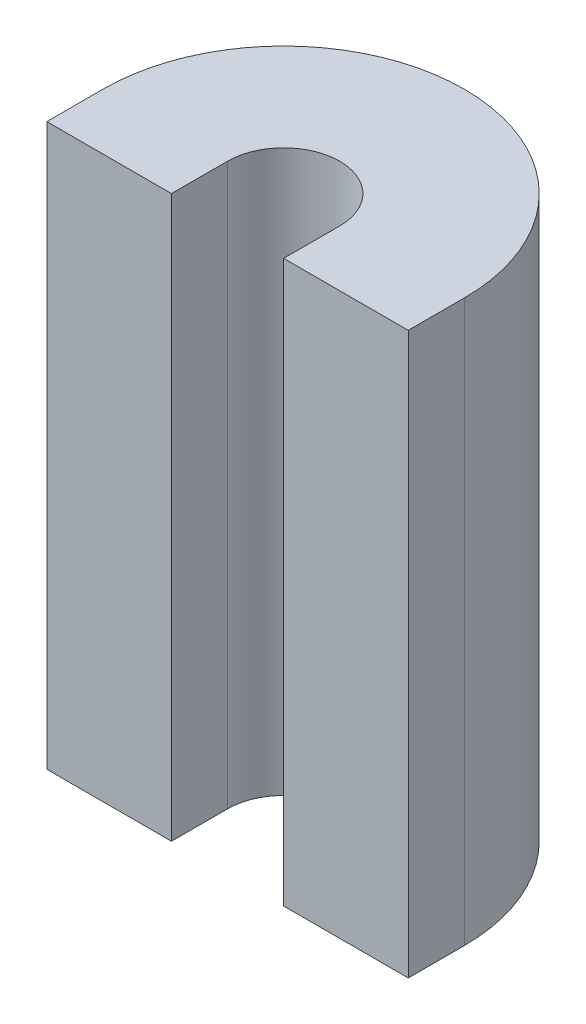
ISO-10303-21;
HEADER;
FILE_DESCRIPTION(('STEP AP214'),'2;1');
FILE_NAME('part.step','',(''),(''),'','','');
FILE_SCHEMA(('AUTOMOTIVE_DESIGN { 1 0 10303 214 1 1 1 1 }'));
ENDSEC;
DATA;
#1=APPLICATION_CONTEXT('core data for automotive mechanical design processes');
#2=APPLICATION_PROTOCOL_DEFINITION('international standard','automotive_design',2000,#1);
#3=PRODUCT_CONTEXT('',#1,'mechanical');
#4=PRODUCT('Part','Part','',(#3));
#5=PRODUCT_RELATED_PRODUCT_CATEGORY('part','',(#4));
#6=PRODUCT_DEFINITION_FORMATION('','',#4);
#7=PRODUCT_DEFINITION_CONTEXT('part definition',#1,'design');
#8=PRODUCT_DEFINITION('design','',#6,#7);
#9=PRODUCT_DEFINITION_SHAPE('','',#8);
#10=(LENGTH_UNIT() NAMED_UNIT(*) SI_UNIT(.MILLI.,.METRE.));
#11=(NAMED_UNIT(*) PLANE_ANGLE_UNIT() SI_UNIT($,.RADIAN.));
#12=(NAMED_UNIT(*) SI_UNIT($,.STERADIAN.) SOLID_ANGLE_UNIT());
#13=UNCERTAINTY_MEASURE_WITH_UNIT(LENGTH_MEASURE(1.E-05),#10,'distance_accuracy_value','');
#14=(GEOMETRIC_REPRESENTATION_CONTEXT(3) GLOBAL_UNCERTAINTY_ASSIGNED_CONTEXT((#13)) GLOBAL_UNIT_ASSIGNED_CONTEXT((#10,
#11,#12)) REPRESENTATION_CONTEXT('',''));
#15=CARTESIAN_POINT('',(0.,0.,0.));
#16=DIRECTION('',(0.,0.,1.));
#17=DIRECTION('',(1.,0.,0.));
#18=AXIS2_PLACEMENT_3D('',#15,#16,#17);
#19=CARTESIAN_POINT('',(-1.8,18.,-1.8));
#20=DIRECTION('',(-1.,0.,-8.08694353766133E-13));
#21=DIRECTION('',(-8.08694353766133E-13,0.,1.));
#22=AXIS2_PLACEMENT_3D('',#19,#20,#21);
#23=PLANE('',#22);
#24=DIRECTION('',(8.08694353766132E-13,0.,-1.));
#25=VECTOR('',#24,1.);
#26=CARTESIAN_POINT('',(-1.8,0.,-1.8));
#27=LINE('',#26,#25);
#28=CARTESIAN_POINT('',(-1.80000000000146,0.,0.));
#29=VERTEX_POINT('',#28);
#30=CARTESIAN_POINT('',(-1.8,0.,-1.8));
#31=VERTEX_POINT('',#30);
#32=EDGE_CURVE('E128',#29,#31,#27,.T.);
#33=ORIENTED_EDGE('',*,*,#32,.T.);
#34=DIRECTION('',(0.,-1.,0.));
#35=VECTOR('',#34,1.);
#36=CARTESIAN_POINT('',(-1.8,18.,-1.8));
#37=LINE('',#36,#35);
#38=CARTESIAN_POINT('',(-1.8,18.,-1.8));
#39=VERTEX_POINT('',#38);
#40=EDGE_CURVE('E11',#39,#31,#37,.T.);
#41=ORIENTED_EDGE('',*,*,#40,.F.);
#42=DIRECTION('',(8.08694353766132E-13,0.,-1.));
#43=VECTOR('',#42,1.);
#44=CARTESIAN_POINT('',(-1.8,18.,-1.8));
#45=LINE('',#44,#43);
#46=CARTESIAN_POINT('',(-1.80000000000146,18.,0.));
#47=VERTEX_POINT('',#46);
#48=EDGE_CURVE('E143',#47,#39,#45,.T.);
#49=ORIENTED_EDGE('',*,*,#48,.F.);
#50=DIRECTION('',(0.,-1.,0.));
#51=VECTOR('',#50,1.);
#52=CARTESIAN_POINT('',(-1.80000000000146,18.,0.));
#53=LINE('',#52,#51);
#54=EDGE_CURVE('E124',#47,#29,#53,.T.);
#55=ORIENTED_EDGE('',*,*,#54,.T.);
#56=EDGE_LOOP('',(#33,#41,#49,#55));
#57=FACE_BOUND('',#56,.T.);
#58=ADVANCED_FACE('F33',(#57),#23,.F.);
#59=CARTESIAN_POINT('',(0.,18.,-1.79999999999999));
#60=DIRECTION('',(0.,-1.,0.));
#61=DIRECTION('',(0.,0.,-1.));
#62=AXIS2_PLACEMENT_3D('',#59,#60,#61);
#63=CYLINDRICAL_SURFACE('',#62,1.8);
#64=CARTESIAN_POINT('',(0.,0.,-1.79999999999999));
#65=DIRECTION('',(0.,-1.,0.));
#66=DIRECTION('',(0.,0.,1.));
#67=AXIS2_PLACEMENT_3D('',#64,#65,#66);
#68=CIRCLE('',#67,1.8);
#69=CARTESIAN_POINT('',(1.8,0.,-1.8));
#70=VERTEX_POINT('',#69);
#71=EDGE_CURVE('E131',#31,#70,#68,.T.);
#72=ORIENTED_EDGE('',*,*,#71,.T.);
#73=DIRECTION('',(0.,-1.,0.));
#74=VECTOR('',#73,1.);
#75=CARTESIAN_POINT('',(1.8,18.,-1.8));
#76=LINE('',#75,#74);
#77=CARTESIAN_POINT('',(1.8,18.,-1.8));
#78=VERTEX_POINT('',#77);
#79=EDGE_CURVE('E41',#78,#70,#76,.T.);
#80=ORIENTED_EDGE('',*,*,#79,.F.);
#81=CARTESIAN_POINT('',(0.,18.,-1.79999999999999));
#82=DIRECTION('',(0.,-1.,0.));
#83=DIRECTION('',(0.,0.,-1.));
#84=AXIS2_PLACEMENT_3D('',#81,#82,#83);
#85=CIRCLE('',#84,1.80000000000001);
#86=EDGE_CURVE('E92',#39,#78,#85,.T.);
#87=ORIENTED_EDGE('',*,*,#86,.F.);
#88=ORIENTED_EDGE('',*,*,#40,.T.);
#89=EDGE_LOOP('',(#72,#80,#87,#88));
#90=FACE_BOUND('',#89,.T.);
#91=ADVANCED_FACE('F178',(#90),#63,.F.);
#92=CARTESIAN_POINT('',(1.8,18.,-1.8));
#93=DIRECTION('',(1.,0.,-8.15681434433262E-13));
#94=DIRECTION('',(-8.15681434433262E-13,0.,-1.));
#95=AXIS2_PLACEMENT_3D('',#92,#93,#94);
#96=PLANE('',#95);
#97=DIRECTION('',(8.15681434433261E-13,0.,1.));
#98=VECTOR('',#97,1.);
#99=CARTESIAN_POINT('',(1.8,0.,-1.8));
#100=LINE('',#99,#98);
#101=CARTESIAN_POINT('',(1.80000000000147,0.,0.));
#102=VERTEX_POINT('',#101);
#103=EDGE_CURVE('E133',#70,#102,#100,.T.);
#104=ORIENTED_EDGE('',*,*,#103,.T.);
#105=DIRECTION('',(0.,-1.,0.));
#106=VECTOR('',#105,1.);
#107=CARTESIAN_POINT('',(1.80000000000147,18.,0.));
#108=LINE('',#107,#106);
#109=CARTESIAN_POINT('',(1.80000000000147,18.,0.));
#110=VERTEX_POINT('',#109);
#111=EDGE_CURVE('E150',#110,#102,#108,.T.);
#112=ORIENTED_EDGE('',*,*,#111,.F.);
#113=DIRECTION('',(8.15681434433261E-13,0.,1.));
#114=VECTOR('',#113,1.);
#115=CARTESIAN_POINT('',(1.8,18.,-1.8));
#116=LINE('',#115,#114);
#117=EDGE_CURVE('E158',#78,#110,#116,.T.);
#118=ORIENTED_EDGE('',*,*,#117,.F.);
#119=ORIENTED_EDGE('',*,*,#79,.T.);
#120=EDGE_LOOP('',(#104,#112,#118,#119));
#121=FACE_BOUND('',#120,.T.);
#122=ADVANCED_FACE('F156',(#121),#96,.F.);
#123=CARTESIAN_POINT('',(1.80000000000147,18.,0.));
#124=DIRECTION('',(0.,0.,-1.));
#125=DIRECTION('',(-1.,0.,0.));
#126=AXIS2_PLACEMENT_3D('',#123,#124,#125);
#127=PLANE('',#126);
#128=DIRECTION('',(1.,0.,0.));
#129=VECTOR('',#128,1.);
#130=CARTESIAN_POINT('',(1.80000000000147,0.,0.));
#131=LINE('',#130,#129);
#132=CARTESIAN_POINT('',(5.80000000000001,0.,0.));
#133=VERTEX_POINT('',#132);
#134=EDGE_CURVE('E135',#102,#133,#131,.T.);
#135=ORIENTED_EDGE('',*,*,#134,.T.);
#136=DIRECTION('',(0.,-1.,0.));
#137=VECTOR('',#136,1.);
#138=CARTESIAN_POINT('',(5.80000000000001,18.,0.));
#139=LINE('',#138,#137);
#140=CARTESIAN_POINT('',(5.80000000000001,18.,0.));
#141=VERTEX_POINT('',#140);
#142=EDGE_CURVE('E147',#141,#133,#139,.T.);
#143=ORIENTED_EDGE('',*,*,#142,.F.);
#144=DIRECTION('',(1.,0.,0.));
#145=VECTOR('',#144,1.);
#146=CARTESIAN_POINT('',(1.80000000000147,18.,0.));
#147=LINE('',#146,#145);
#148=EDGE_CURVE('E170',#110,#141,#147,.T.);
#149=ORIENTED_EDGE('',*,*,#148,.F.);
#150=ORIENTED_EDGE('',*,*,#111,.T.);
#151=EDGE_LOOP('',(#135,#143,#149,#150));
#152=FACE_BOUND('',#151,.T.);
#153=ADVANCED_FACE('F166',(#152),#127,.F.);
#154=CARTESIAN_POINT('',(5.80000000000001,18.,0.));
#155=DIRECTION('',(-1.,0.,0.));
#156=DIRECTION('',(0.,0.,1.));
#157=AXIS2_PLACEMENT_3D('',#154,#155,#156);
#158=PLANE('',#157);
#159=DIRECTION('',(0.,0.,-1.));
#160=VECTOR('',#159,1.);
#161=CARTESIAN_POINT('',(5.80000000000001,0.,0.));
#162=LINE('',#161,#160);
#163=CARTESIAN_POINT('',(5.80000000000001,0.,-1.80000000000002));
#164=VERTEX_POINT('',#163);
#165=EDGE_CURVE('E137',#133,#164,#162,.T.);
#166=ORIENTED_EDGE('',*,*,#165,.T.);
#167=DIRECTION('',(0.,-1.,0.));
#168=VECTOR('',#167,1.);
#169=CARTESIAN_POINT('',(5.80000000000001,18.,-1.80000000000002));
#170=LINE('',#169,#168);
#171=CARTESIAN_POINT('',(5.80000000000001,18.,-1.80000000000002));
#172=VERTEX_POINT('',#171);
#173=EDGE_CURVE('E119',#172,#164,#170,.T.);
#174=ORIENTED_EDGE('',*,*,#173,.F.);
#175=DIRECTION('',(0.,0.,-1.));
#176=VECTOR('',#175,1.);
#177=CARTESIAN_POINT('',(5.80000000000001,18.,0.));
#178=LINE('',#177,#176);
#179=EDGE_CURVE('E111',#141,#172,#178,.T.);
#180=ORIENTED_EDGE('',*,*,#179,.F.);
#181=ORIENTED_EDGE('',*,*,#142,.T.);
#182=EDGE_LOOP('',(#166,#174,#180,#181));
#183=FACE_BOUND('',#182,.T.);
#184=ADVANCED_FACE('F169',(#183),#158,.F.);
#185=CARTESIAN_POINT('',(0.,18.,-1.79999999999999));
#186=DIRECTION('',(0.,-1.,0.));
#187=DIRECTION('',(0.,0.,-1.));
#188=AXIS2_PLACEMENT_3D('',#185,#186,#187);
#189=CYLINDRICAL_SURFACE('',#188,5.80000000000001);
#190=CARTESIAN_POINT('',(0.,0.,-1.79999999999999));
#191=DIRECTION('',(0.,1.,0.));
#192=DIRECTION('',(0.,0.,-1.));
#193=AXIS2_PLACEMENT_3D('',#190,#191,#192);
#194=CIRCLE('',#193,5.80000000000001);
#195=CARTESIAN_POINT('',(-5.8,0.,-1.8));
#196=VERTEX_POINT('',#195);
#197=EDGE_CURVE('E118',#164,#196,#194,.T.);
#198=ORIENTED_EDGE('',*,*,#197,.T.);
#199=DIRECTION('',(0.,-1.,0.));
#200=VECTOR('',#199,1.);
#201=CARTESIAN_POINT('',(-5.8,18.,-1.8));
#202=LINE('',#201,#200);
#203=CARTESIAN_POINT('',(-5.8,18.,-1.8));
#204=VERTEX_POINT('',#203);
#205=EDGE_CURVE('E116',#204,#196,#202,.T.);
#206=ORIENTED_EDGE('',*,*,#205,.F.);
#207=CARTESIAN_POINT('',(0.,18.,-1.79999999999999));
#208=DIRECTION('',(0.,1.,0.));
#209=DIRECTION('',(0.,0.,1.));
#210=AXIS2_PLACEMENT_3D('',#207,#208,#209);
#211=CIRCLE('',#210,5.8);
#212=EDGE_CURVE('E105',#172,#204,#211,.T.);
#213=ORIENTED_EDGE('',*,*,#212,.F.);
#214=ORIENTED_EDGE('',*,*,#173,.T.);
#215=EDGE_LOOP('',(#198,#206,#213,#214));
#216=FACE_BOUND('',#215,.T.);
#217=ADVANCED_FACE('F117',(#216),#189,.T.);
#218=CARTESIAN_POINT('',(-5.8,18.,0.));
#219=DIRECTION('',(1.,0.,0.));
#220=DIRECTION('',(0.,0.,-1.));
#221=AXIS2_PLACEMENT_3D('',#218,#219,#220);
#222=PLANE('',#221);
#223=DIRECTION('',(0.,0.,1.));
#224=VECTOR('',#223,1.);
#225=CARTESIAN_POINT('',(-5.8,0.,0.));
#226=LINE('',#225,#224);
#227=CARTESIAN_POINT('',(-5.8,0.,0.));
#228=VERTEX_POINT('',#227);
#229=EDGE_CURVE('E78',#196,#228,#226,.T.);
#230=ORIENTED_EDGE('',*,*,#229,.T.);
#231=DIRECTION('',(0.,-1.,0.));
#232=VECTOR('',#231,1.);
#233=CARTESIAN_POINT('',(-5.8,18.,0.));
#234=LINE('',#233,#232);
#235=CARTESIAN_POINT('',(-5.8,18.,0.));
#236=VERTEX_POINT('',#235);
#237=EDGE_CURVE('E120',#236,#228,#234,.T.);
#238=ORIENTED_EDGE('',*,*,#237,.F.);
#239=DIRECTION('',(0.,0.,1.));
#240=VECTOR('',#239,1.);
#241=CARTESIAN_POINT('',(-5.8,18.,0.));
#242=LINE('',#241,#240);
#243=EDGE_CURVE('E109',#204,#236,#242,.T.);
#244=ORIENTED_EDGE('',*,*,#243,.F.);
#245=ORIENTED_EDGE('',*,*,#205,.T.);
#246=EDGE_LOOP('',(#230,#238,#244,#245));
#247=FACE_BOUND('',#246,.T.);
#248=ADVANCED_FACE('F122',(#247),#222,.F.);
#249=CARTESIAN_POINT('',(-1.80000000000146,18.,0.));
#250=DIRECTION('',(0.,0.,-1.));
#251=DIRECTION('',(-1.,0.,0.));
#252=AXIS2_PLACEMENT_3D('',#249,#250,#251);
#253=PLANE('',#252);
#254=DIRECTION('',(1.,0.,0.));
#255=VECTOR('',#254,1.);
#256=CARTESIAN_POINT('',(-1.80000000000146,0.,0.));
#257=LINE('',#256,#255);
#258=EDGE_CURVE('E84',#228,#29,#257,.T.);
#259=ORIENTED_EDGE('',*,*,#258,.T.);
#260=ORIENTED_EDGE('',*,*,#54,.F.);
#261=DIRECTION('',(1.,0.,0.));
#262=VECTOR('',#261,1.);
#263=CARTESIAN_POINT('',(-1.80000000000146,18.,0.));
#264=LINE('',#263,#262);
#265=EDGE_CURVE('E49',#236,#47,#264,.T.);
#266=ORIENTED_EDGE('',*,*,#265,.F.);
#267=ORIENTED_EDGE('',*,*,#237,.T.);
#268=EDGE_LOOP('',(#259,#260,#266,#267));
#269=FACE_BOUND('',#268,.T.);
#270=ADVANCED_FACE('F194',(#269),#253,.F.);
#271=CARTESIAN_POINT('',(0.,18.,-1.79999999999999));
#272=DIRECTION('',(0.,-1.,0.));
#273=DIRECTION('',(0.,0.,-1.));
#274=AXIS2_PLACEMENT_3D('',#271,#272,#273);
#275=PLANE('',#274);
#276=ORIENTED_EDGE('',*,*,#48,.T.);
#277=ORIENTED_EDGE('',*,*,#86,.T.);
#278=ORIENTED_EDGE('',*,*,#117,.T.);
#279=ORIENTED_EDGE('',*,*,#148,.T.);
#280=ORIENTED_EDGE('',*,*,#179,.T.);
#281=ORIENTED_EDGE('',*,*,#212,.T.);
#282=ORIENTED_EDGE('',*,*,#243,.T.);
#283=ORIENTED_EDGE('',*,*,#265,.T.);
#284=EDGE_LOOP('',(#276,#277,#278,#279,#280,#281,#282,#283));
#285=FACE_BOUND('',#284,.T.);
#286=ADVANCED_FACE('F107',(#285),#275,.F.);
#287=CARTESIAN_POINT('',(0.,0.,-1.79999999999999));
#288=DIRECTION('',(0.,-1.,0.));
#289=DIRECTION('',(0.,0.,-1.));
#290=AXIS2_PLACEMENT_3D('',#287,#288,#289);
#291=PLANE('',#290);
#292=ORIENTED_EDGE('',*,*,#32,.F.);
#293=ORIENTED_EDGE('',*,*,#258,.F.);
#294=ORIENTED_EDGE('',*,*,#229,.F.);
#295=ORIENTED_EDGE('',*,*,#197,.F.);
#296=ORIENTED_EDGE('',*,*,#165,.F.);
#297=ORIENTED_EDGE('',*,*,#134,.F.);
#298=ORIENTED_EDGE('',*,*,#103,.F.);
#299=ORIENTED_EDGE('',*,*,#71,.F.);
#300=EDGE_LOOP('',(#292,#293,#294,#295,#296,#297,#298,#299));
#301=FACE_BOUND('',#300,.T.);
#302=ADVANCED_FACE('F162',(#301),#291,.T.);
#303=CLOSED_SHELL('',(#58,#91,#122,#153,#184,#217,#248,#270,#286,#302));
#304=MANIFOLD_SOLID_BREP('B2',#303);
#305=ADVANCED_BREP_SHAPE_REPRESENTATION('',(#18,#304),#14);
#306=SHAPE_DEFINITION_REPRESENTATION(#9,#305);
ENDSEC;
END-ISO-10303-21;
